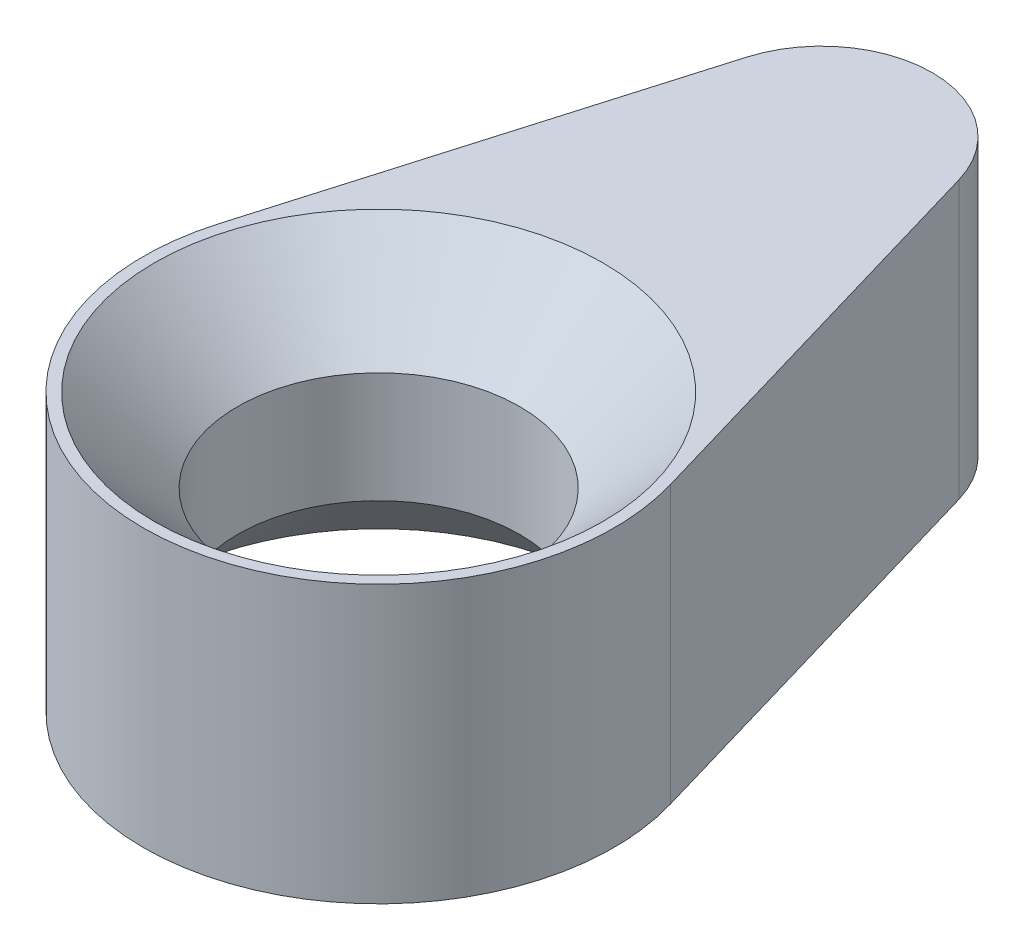
ISO-10303-21;
HEADER;
FILE_DESCRIPTION(('STEP AP214'),'2;1');
FILE_NAME('part.step','',(''),(''),'','','');
FILE_SCHEMA(('AUTOMOTIVE_DESIGN { 1 0 10303 214 1 1 1 1 }'));
ENDSEC;
DATA;
#1=APPLICATION_CONTEXT('core data for automotive mechanical design processes');
#2=APPLICATION_PROTOCOL_DEFINITION('international standard','automotive_design',2000,#1);
#3=PRODUCT_CONTEXT('',#1,'mechanical');
#4=PRODUCT('Part','Part','',(#3));
#5=PRODUCT_RELATED_PRODUCT_CATEGORY('part','',(#4));
#6=PRODUCT_DEFINITION_FORMATION('','',#4);
#7=PRODUCT_DEFINITION_CONTEXT('part definition',#1,'design');
#8=PRODUCT_DEFINITION('design','',#6,#7);
#9=PRODUCT_DEFINITION_SHAPE('','',#8);
#10=(LENGTH_UNIT() NAMED_UNIT(*) SI_UNIT(.MILLI.,.METRE.));
#11=(NAMED_UNIT(*) PLANE_ANGLE_UNIT() SI_UNIT($,.RADIAN.));
#12=(NAMED_UNIT(*) SI_UNIT($,.STERADIAN.) SOLID_ANGLE_UNIT());
#13=UNCERTAINTY_MEASURE_WITH_UNIT(LENGTH_MEASURE(1.E-05),#10,'distance_accuracy_value','');
#14=(GEOMETRIC_REPRESENTATION_CONTEXT(3) GLOBAL_UNCERTAINTY_ASSIGNED_CONTEXT((#13)) GLOBAL_UNIT_ASSIGNED_CONTEXT((#10,
#11,#12)) REPRESENTATION_CONTEXT('',''));
#15=CARTESIAN_POINT('',(0.,0.,0.));
#16=DIRECTION('',(0.,0.,1.));
#17=DIRECTION('',(1.,0.,0.));
#18=AXIS2_PLACEMENT_3D('',#15,#16,#17);
#19=CARTESIAN_POINT('',(0.,12.7,-20.32));
#20=DIRECTION('',(0.,-1.,0.));
#21=DIRECTION('',(0.,0.,-1.));
#22=AXIS2_PLACEMENT_3D('',#19,#20,#21);
#23=CYLINDRICAL_SURFACE('',#22,5.08);
#24=CARTESIAN_POINT('',(0.,0.,-20.32));
#25=DIRECTION('',(0.,1.,0.));
#26=DIRECTION('',(0.,0.,1.));
#27=AXIS2_PLACEMENT_3D('',#24,#25,#26);
#28=CIRCLE('',#27,5.08);
#29=CARTESIAN_POINT('',(-4.87494342915895,0.,-21.74875));
#30=VERTEX_POINT('',#29);
#31=CARTESIAN_POINT('',(4.87494342915895,0.,-21.74875));
#32=VERTEX_POINT('',#31);
#33=EDGE_CURVE('E125',#30,#32,#28,.F.);
#34=ORIENTED_EDGE('',*,*,#33,.F.);
#35=DIRECTION('',(0.,-1.,0.));
#36=VECTOR('',#35,1.);
#37=CARTESIAN_POINT('',(-4.87494342915895,12.7,-21.74875));
#38=LINE('',#37,#36);
#39=CARTESIAN_POINT('',(-4.87494342915895,12.7,-21.74875));
#40=VERTEX_POINT('',#39);
#41=EDGE_CURVE('E91',#40,#30,#38,.T.);
#42=ORIENTED_EDGE('',*,*,#41,.F.);
#43=CARTESIAN_POINT('',(0.,12.7,-20.32));
#44=DIRECTION('',(0.,1.,0.));
#45=DIRECTION('',(0.,0.,1.));
#46=AXIS2_PLACEMENT_3D('',#43,#44,#45);
#47=CIRCLE('',#46,5.08);
#48=CARTESIAN_POINT('',(4.87494342915895,12.7,-21.74875));
#49=VERTEX_POINT('',#48);
#50=EDGE_CURVE('E116',#40,#49,#47,.F.);
#51=ORIENTED_EDGE('',*,*,#50,.T.);
#52=DIRECTION('',(0.,-1.,0.));
#53=VECTOR('',#52,1.);
#54=CARTESIAN_POINT('',(4.87494342915895,12.7,-21.74875));
#55=LINE('',#54,#53);
#56=EDGE_CURVE('E68',#49,#32,#55,.T.);
#57=ORIENTED_EDGE('',*,*,#56,.T.);
#58=EDGE_LOOP('',(#34,#42,#51,#57));
#59=FACE_BOUND('',#58,.T.);
#60=ADVANCED_FACE('F49',(#59),#23,.T.);
#61=CARTESIAN_POINT('',(-10.3592547869628,12.7,-3.03609375));
#62=DIRECTION('',(-0.959634533299005,0.,-0.28125));
#63=DIRECTION('',(-0.28125,0.,0.959634533299005));
#64=AXIS2_PLACEMENT_3D('',#61,#62,#63);
#65=PLANE('',#64);
#66=DIRECTION('',(0.28125,0.,-0.959634533299005));
#67=VECTOR('',#66,1.);
#68=CARTESIAN_POINT('',(-10.3592547869628,0.,-3.03609375));
#69=LINE('',#68,#67);
#70=CARTESIAN_POINT('',(-10.3592547869628,0.,-3.03609375));
#71=VERTEX_POINT('',#70);
#72=EDGE_CURVE('E103',#71,#30,#69,.T.);
#73=ORIENTED_EDGE('',*,*,#72,.F.);
#74=DIRECTION('',(0.,-1.,0.));
#75=VECTOR('',#74,1.);
#76=CARTESIAN_POINT('',(-10.3592547869628,12.7,-3.03609375));
#77=LINE('',#76,#75);
#78=CARTESIAN_POINT('',(-10.3592547869628,12.7,-3.03609375));
#79=VERTEX_POINT('',#78);
#80=EDGE_CURVE('E97',#79,#71,#77,.T.);
#81=ORIENTED_EDGE('',*,*,#80,.F.);
#82=DIRECTION('',(0.28125,0.,-0.959634533299005));
#83=VECTOR('',#82,1.);
#84=CARTESIAN_POINT('',(-10.3592547869628,12.7,-3.03609375));
#85=LINE('',#84,#83);
#86=EDGE_CURVE('E101',#79,#40,#85,.T.);
#87=ORIENTED_EDGE('',*,*,#86,.T.);
#88=ORIENTED_EDGE('',*,*,#41,.T.);
#89=EDGE_LOOP('',(#73,#81,#87,#88));
#90=FACE_BOUND('',#89,.T.);
#91=ADVANCED_FACE('F99',(#90),#65,.T.);
#92=CARTESIAN_POINT('',(0.,12.7,0.));
#93=DIRECTION('',(0.,-1.,0.));
#94=DIRECTION('',(0.,0.,-1.));
#95=AXIS2_PLACEMENT_3D('',#92,#93,#94);
#96=CYLINDRICAL_SURFACE('',#95,10.795);
#97=CARTESIAN_POINT('',(0.,0.,0.));
#98=DIRECTION('',(0.,1.,0.));
#99=DIRECTION('',(0.,0.,1.));
#100=AXIS2_PLACEMENT_3D('',#97,#98,#99);
#101=CIRCLE('',#100,10.795);
#102=CARTESIAN_POINT('',(10.3592547869628,0.,-3.03609375));
#103=VERTEX_POINT('',#102);
#104=EDGE_CURVE('E130',#71,#103,#101,.T.);
#105=ORIENTED_EDGE('',*,*,#104,.T.);
#106=DIRECTION('',(0.,-1.,0.));
#107=VECTOR('',#106,1.);
#108=CARTESIAN_POINT('',(10.3592547869628,12.7,-3.03609375));
#109=LINE('',#108,#107);
#110=CARTESIAN_POINT('',(10.3592547869628,12.7,-3.03609375));
#111=VERTEX_POINT('',#110);
#112=EDGE_CURVE('E83',#111,#103,#109,.T.);
#113=ORIENTED_EDGE('',*,*,#112,.F.);
#114=CARTESIAN_POINT('',(0.,12.7,0.));
#115=DIRECTION('',(0.,1.,0.));
#116=DIRECTION('',(0.,0.,1.));
#117=AXIS2_PLACEMENT_3D('',#114,#115,#116);
#118=CIRCLE('',#117,10.795);
#119=EDGE_CURVE('E108',#79,#111,#118,.T.);
#120=ORIENTED_EDGE('',*,*,#119,.F.);
#121=ORIENTED_EDGE('',*,*,#80,.T.);
#122=EDGE_LOOP('',(#105,#113,#120,#121));
#123=FACE_BOUND('',#122,.T.);
#124=ADVANCED_FACE('F109',(#123),#96,.T.);
#125=CARTESIAN_POINT('',(10.3592547869628,12.7,-3.03609375));
#126=DIRECTION('',(0.959634533299005,0.,-0.28125));
#127=DIRECTION('',(-0.28125,0.,-0.959634533299005));
#128=AXIS2_PLACEMENT_3D('',#125,#126,#127);
#129=PLANE('',#128);
#130=DIRECTION('',(0.28125,0.,0.959634533299005));
#131=VECTOR('',#130,1.);
#132=CARTESIAN_POINT('',(10.3592547869628,0.,-3.03609375));
#133=LINE('',#132,#131);
#134=EDGE_CURVE('E120',#32,#103,#133,.T.);
#135=ORIENTED_EDGE('',*,*,#134,.F.);
#136=ORIENTED_EDGE('',*,*,#56,.F.);
#137=DIRECTION('',(0.28125,0.,0.959634533299005));
#138=VECTOR('',#137,1.);
#139=CARTESIAN_POINT('',(10.3592547869628,12.7,-3.03609375));
#140=LINE('',#139,#138);
#141=EDGE_CURVE('E113',#49,#111,#140,.T.);
#142=ORIENTED_EDGE('',*,*,#141,.T.);
#143=ORIENTED_EDGE('',*,*,#112,.T.);
#144=EDGE_LOOP('',(#135,#136,#142,#143));
#145=FACE_BOUND('',#144,.T.);
#146=ADVANCED_FACE('F165',(#145),#129,.T.);
#147=CARTESIAN_POINT('',(0.,12.7,0.));
#148=DIRECTION('',(0.,-1.,0.));
#149=DIRECTION('',(0.,0.,-1.));
#150=AXIS2_PLACEMENT_3D('',#147,#148,#149);
#151=CYLINDRICAL_SURFACE('',#150,6.477);
#152=CARTESIAN_POINT('',(0.,3.81000000000001,0.));
#153=DIRECTION('',(0.,1.,0.));
#154=DIRECTION('',(0.,0.,1.));
#155=AXIS2_PLACEMENT_3D('',#152,#153,#154);
#156=CIRCLE('',#155,6.477);
#157=CARTESIAN_POINT('',(0.,3.81000000000001,-6.477));
#158=VERTEX_POINT('',#157);
#159=EDGE_CURVE('E60',#158,#158,#156,.F.);
#160=ORIENTED_EDGE('',*,*,#159,.T.);
#161=EDGE_LOOP('',(#160));
#162=FACE_BOUND('',#161,.T.);
#163=CARTESIAN_POINT('',(0.,8.89000000000001,0.));
#164=DIRECTION('',(0.,1.,0.));
#165=DIRECTION('',(0.,0.,1.));
#166=AXIS2_PLACEMENT_3D('',#163,#164,#165);
#167=CIRCLE('',#166,6.477);
#168=CARTESIAN_POINT('',(0.,8.89000000000001,6.477));
#169=VERTEX_POINT('',#168);
#170=EDGE_CURVE('E146',#169,#169,#167,.T.);
#171=ORIENTED_EDGE('',*,*,#170,.T.);
#172=EDGE_LOOP('',(#171));
#173=FACE_BOUND('',#172,.T.);
#174=ADVANCED_FACE('F153',(#162,#173),#151,.F.);
#175=CARTESIAN_POINT('',(0.,12.7,0.));
#176=DIRECTION('',(0.,1.,0.));
#177=DIRECTION('',(0.,0.,1.));
#178=AXIS2_PLACEMENT_3D('',#175,#176,#177);
#179=PLANE('',#178);
#180=CARTESIAN_POINT('',(0.,12.7,0.));
#181=DIRECTION('',(0.,1.,0.));
#182=DIRECTION('',(0.,0.,1.));
#183=AXIS2_PLACEMENT_3D('',#180,#181,#182);
#184=CIRCLE('',#183,10.287);
#185=CARTESIAN_POINT('',(0.,12.7,10.287));
#186=VERTEX_POINT('',#185);
#187=EDGE_CURVE('E11',#186,#186,#184,.F.);
#188=ORIENTED_EDGE('',*,*,#187,.T.);
#189=EDGE_LOOP('',(#188));
#190=FACE_BOUND('',#189,.T.);
#191=ORIENTED_EDGE('',*,*,#50,.F.);
#192=ORIENTED_EDGE('',*,*,#86,.F.);
#193=ORIENTED_EDGE('',*,*,#119,.T.);
#194=ORIENTED_EDGE('',*,*,#141,.F.);
#195=EDGE_LOOP('',(#191,#192,#193,#194));
#196=FACE_BOUND('',#195,.T.);
#197=ADVANCED_FACE('F115',(#190,#196),#179,.T.);
#198=CARTESIAN_POINT('',(0.,0.,0.));
#199=DIRECTION('',(0.,1.,0.));
#200=DIRECTION('',(0.,0.,1.));
#201=AXIS2_PLACEMENT_3D('',#198,#199,#200);
#202=PLANE('',#201);
#203=CARTESIAN_POINT('',(0.,0.,0.));
#204=DIRECTION('',(0.,1.,0.));
#205=DIRECTION('',(0.,0.,1.));
#206=AXIS2_PLACEMENT_3D('',#203,#204,#205);
#207=CIRCLE('',#206,10.287);
#208=CARTESIAN_POINT('',(0.,0.,-10.287));
#209=VERTEX_POINT('',#208);
#210=EDGE_CURVE('E142',#209,#209,#207,.T.);
#211=ORIENTED_EDGE('',*,*,#210,.T.);
#212=EDGE_LOOP('',(#211));
#213=FACE_BOUND('',#212,.T.);
#214=ORIENTED_EDGE('',*,*,#33,.T.);
#215=ORIENTED_EDGE('',*,*,#134,.T.);
#216=ORIENTED_EDGE('',*,*,#104,.F.);
#217=ORIENTED_EDGE('',*,*,#72,.T.);
#218=EDGE_LOOP('',(#214,#215,#216,#217));
#219=FACE_BOUND('',#218,.T.);
#220=ADVANCED_FACE('F159',(#213,#219),#202,.F.);
#221=CARTESIAN_POINT('',(0.,0.,0.));
#222=DIRECTION('',(0.,-1.,0.));
#223=DIRECTION('',(0.,0.,-1.));
#224=AXIS2_PLACEMENT_3D('',#221,#222,#223);
#225=CONICAL_SURFACE('',#224,10.287,0.785398163397446);
#226=CARTESIAN_POINT('',(0.,3.81000000000001,-6.477));
#227=CARTESIAN_POINT('',(0.,3.77031250000001,-6.5166875));
#228=CARTESIAN_POINT('',(0.,3.73062500000001,-6.556375));
#229=CARTESIAN_POINT('',(0.,3.65125,-6.63575));
#230=CARTESIAN_POINT('',(0.,3.61156250000001,-6.6754375));
#231=CARTESIAN_POINT('',(0.,3.5321875,-6.7548125));
#232=CARTESIAN_POINT('',(0.,3.49250000000001,-6.7945));
#233=CARTESIAN_POINT('',(0.,3.413125,-6.873875));
#234=CARTESIAN_POINT('',(0.,3.3734375,-6.9135625));
#235=CARTESIAN_POINT('',(0.,3.2940625,-6.9929375));
#236=CARTESIAN_POINT('',(0.,3.254375,-7.032625));
#237=CARTESIAN_POINT('',(0.,3.175,-7.112));
#238=CARTESIAN_POINT('',(0.,3.1353125,-7.1516875));
#239=CARTESIAN_POINT('',(0.,3.0559375,-7.2310625));
#240=CARTESIAN_POINT('',(0.,3.01625,-7.27075));
#241=CARTESIAN_POINT('',(0.,2.936875,-7.350125));
#242=CARTESIAN_POINT('',(0.,2.8971875,-7.3898125));
#243=CARTESIAN_POINT('',(0.,2.8178125,-7.4691875));
#244=CARTESIAN_POINT('',(0.,2.778125,-7.508875));
#245=CARTESIAN_POINT('',(0.,2.69875,-7.58825));
#246=CARTESIAN_POINT('',(0.,2.6590625,-7.6279375));
#247=CARTESIAN_POINT('',(0.,2.5796875,-7.7073125));
#248=CARTESIAN_POINT('',(0.,2.54,-7.747));
#249=CARTESIAN_POINT('',(0.,2.460625,-7.826375));
#250=CARTESIAN_POINT('',(0.,2.4209375,-7.8660625));
#251=CARTESIAN_POINT('',(0.,2.3415625,-7.9454375));
#252=CARTESIAN_POINT('',(0.,2.301875,-7.985125));
#253=CARTESIAN_POINT('',(0.,2.2225,-8.0645));
#254=CARTESIAN_POINT('',(0.,2.1828125,-8.10418749999999));
#255=CARTESIAN_POINT('',(0.,2.1034375,-8.1835625));
#256=CARTESIAN_POINT('',(0.,2.06375,-8.22325));
#257=CARTESIAN_POINT('',(0.,1.984375,-8.302625));
#258=CARTESIAN_POINT('',(0.,1.9446875,-8.34231249999999));
#259=CARTESIAN_POINT('',(0.,1.8653125,-8.4216875));
#260=CARTESIAN_POINT('',(0.,1.825625,-8.46137499999999));
#261=CARTESIAN_POINT('',(0.,1.74625,-8.54074999999999));
#262=CARTESIAN_POINT('',(0.,1.7065625,-8.5804375));
#263=CARTESIAN_POINT('',(0.,1.6271875,-8.6598125));
#264=CARTESIAN_POINT('',(0.,1.5875,-8.6995));
#265=CARTESIAN_POINT('',(0.,1.508125,-8.778875));
#266=CARTESIAN_POINT('',(0.,1.4684375,-8.8185625));
#267=CARTESIAN_POINT('',(0.,1.3890625,-8.89793749999999));
#268=CARTESIAN_POINT('',(0.,1.349375,-8.93762499999999));
#269=CARTESIAN_POINT('',(0.,1.27,-9.01699999999999));
#270=CARTESIAN_POINT('',(0.,1.2303125,-9.05668749999999));
#271=CARTESIAN_POINT('',(0.,1.1509375,-9.13606249999999));
#272=CARTESIAN_POINT('',(0.,1.11125,-9.17574999999999));
#273=CARTESIAN_POINT('',(0.,1.031875,-9.25512499999999));
#274=CARTESIAN_POINT('',(0.,0.992187500000001,-9.29481249999999));
#275=CARTESIAN_POINT('',(0.,0.912812500000001,-9.37418749999999));
#276=CARTESIAN_POINT('',(0.,0.873125000000001,-9.41387499999999));
#277=CARTESIAN_POINT('',(0.,0.793750000000001,-9.49324999999999));
#278=CARTESIAN_POINT('',(0.,0.754062500000001,-9.53293749999999));
#279=CARTESIAN_POINT('',(0.,0.674687500000001,-9.61231249999999));
#280=CARTESIAN_POINT('',(0.,0.635000000000001,-9.65199999999999));
#281=CARTESIAN_POINT('',(0.,0.555625000000001,-9.73137499999999));
#282=CARTESIAN_POINT('',(0.,0.515937500000001,-9.77106249999999));
#283=CARTESIAN_POINT('',(0.,0.436562500000001,-9.85043749999999));
#284=CARTESIAN_POINT('',(0.,0.396875000000001,-9.89012499999999));
#285=CARTESIAN_POINT('',(0.,0.317500000000001,-9.96949999999999));
#286=CARTESIAN_POINT('',(0.,0.277812500000001,-10.0091875));
#287=CARTESIAN_POINT('',(0.,0.198437500000001,-10.0885625));
#288=CARTESIAN_POINT('',(0.,0.15875,-10.12825));
#289=CARTESIAN_POINT('',(0.,0.0793750000000001,-10.207625));
#290=CARTESIAN_POINT('',(0.,0.0396874999999999,-10.2473125));
#291=CARTESIAN_POINT('',(0.,0.,-10.287));
#292=B_SPLINE_CURVE_WITH_KNOTS('',3,(#226,#227,#228,#229,#230,#231,#232,#233,#234,#235,#236,
#237,#238,#239,#240,#241,#242,#243,#244,#245,#246,#247,#248,#249,#250,#251,#252,#253,#254,#255,
#256,#257,#258,#259,#260,#261,#262,#263,#264,#265,#266,#267,#268,#269,#270,#271,#272,#273,#274,
#275,#276,#277,#278,#279,#280,#281,#282,#283,#284,#285,#286,#287,#288,#289,#290,#291),
.UNSPECIFIED.,.F.,.F.,(4,2,2,2,2,2,2,2,2,2,2,2,2,2,2,2,2,2,2,2,2,2,2,2,2,2,2,2,2,2,2,2,4),(0.,
0.168379802270046,0.336759604540093,0.50513940681014,0.673519209080187,0.841899011350233,
1.01027881362028,1.17865861589033,1.34703841816037,1.51541822043042,1.68379802270047,
1.85217782497051,2.02055762724056,2.1889374295106,2.35731723178065,2.5256970340507,
2.69407683632074,2.86245663859079,3.03083644086084,3.19921624313088,3.36759604540093,
3.53597584767098,3.70435564994102,3.87273545221107,4.04111525448112,4.20949505675116,
4.37787485902121,4.54625466129126,4.7146344635613,4.88301426583135,5.0513940681014,
5.21977387037144,5.38815367264149),.UNSPECIFIED.);
#293=EDGE_CURVE('BSEAM156',#158,#209,#292,.T.);
#294=ORIENTED_EDGE('',*,*,#159,.F.);
#295=ORIENTED_EDGE('',*,*,#210,.F.);
#296=ORIENTED_EDGE('',*,*,#293,.T.);
#297=ORIENTED_EDGE('',*,*,#293,.F.);
#298=EDGE_LOOP('',(#294,#296,#295,#297));
#299=FACE_BOUND('',#298,.T.);
#300=ADVANCED_FACE('F156',(#299),#225,.F.);
#301=CARTESIAN_POINT('',(0.,8.89000000000001,0.));
#302=DIRECTION('',(0.,1.,0.));
#303=DIRECTION('',(0.,0.,1.));
#304=AXIS2_PLACEMENT_3D('',#301,#302,#303);
#305=CONICAL_SURFACE('',#304,6.477,0.78539816339745);
#306=ORIENTED_EDGE('',*,*,#187,.F.);
#307=EDGE_LOOP('',(#306));
#308=FACE_BOUND('',#307,.T.);
#309=ORIENTED_EDGE('',*,*,#170,.F.);
#310=EDGE_LOOP('',(#309));
#311=FACE_BOUND('',#310,.T.);
#312=ADVANCED_FACE('F52',(#308,#311),#305,.F.);
#313=CLOSED_SHELL('',(#60,#91,#124,#146,#174,#197,#220,#300,#312));
#314=MANIFOLD_SOLID_BREP('B2',#313);
#315=ADVANCED_BREP_SHAPE_REPRESENTATION('',(#18,#314),#14);
#316=SHAPE_DEFINITION_REPRESENTATION(#9,#315);
ENDSEC;
END-ISO-10303-21;
